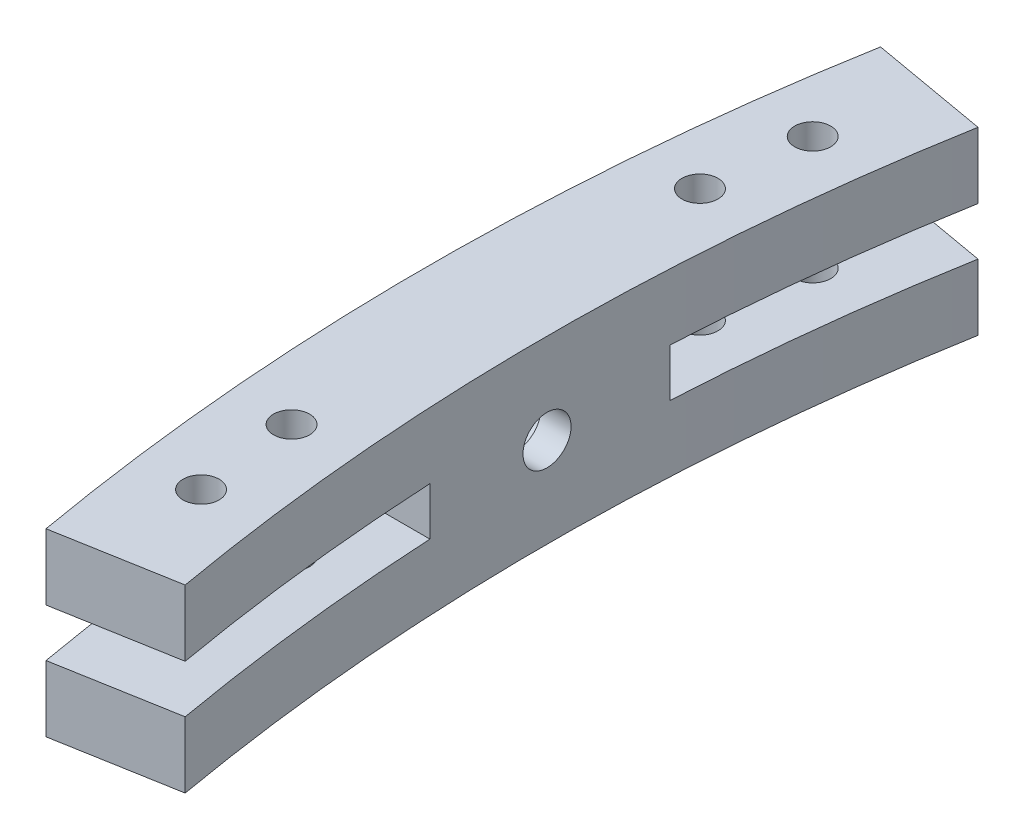
ISO-10303-21;
HEADER;
FILE_DESCRIPTION(('STEP AP214'),'2;1');
FILE_NAME('part.step','',(''),(''),'','','');
FILE_SCHEMA(('AUTOMOTIVE_DESIGN { 1 0 10303 214 1 1 1 1 }'));
ENDSEC;
DATA;
#1=APPLICATION_CONTEXT('core data for automotive mechanical design processes');
#2=APPLICATION_PROTOCOL_DEFINITION('international standard','automotive_design',2000,#1);
#3=PRODUCT_CONTEXT('',#1,'mechanical');
#4=PRODUCT('Part','Part','',(#3));
#5=PRODUCT_RELATED_PRODUCT_CATEGORY('part','',(#4));
#6=PRODUCT_DEFINITION_FORMATION('','',#4);
#7=PRODUCT_DEFINITION_CONTEXT('part definition',#1,'design');
#8=PRODUCT_DEFINITION('design','',#6,#7);
#9=PRODUCT_DEFINITION_SHAPE('','',#8);
#10=(LENGTH_UNIT() NAMED_UNIT(*) SI_UNIT(.MILLI.,.METRE.));
#11=(NAMED_UNIT(*) PLANE_ANGLE_UNIT() SI_UNIT($,.RADIAN.));
#12=(NAMED_UNIT(*) SI_UNIT($,.STERADIAN.) SOLID_ANGLE_UNIT());
#13=UNCERTAINTY_MEASURE_WITH_UNIT(LENGTH_MEASURE(1.E-05),#10,'distance_accuracy_value','');
#14=(GEOMETRIC_REPRESENTATION_CONTEXT(3) GLOBAL_UNCERTAINTY_ASSIGNED_CONTEXT((#13)) GLOBAL_UNIT_ASSIGNED_CONTEXT((#10,
#11,#12)) REPRESENTATION_CONTEXT('',''));
#15=CARTESIAN_POINT('',(0.,0.,0.));
#16=DIRECTION('',(0.,0.,1.));
#17=DIRECTION('',(1.,0.,0.));
#18=AXIS2_PLACEMENT_3D('',#15,#16,#17);
#19=CARTESIAN_POINT('',(0.,7.5,0.));
#20=DIRECTION('',(-0.173648177666931,0.,0.984807753012208));
#21=DIRECTION('',(0.984807753012208,0.,0.173648177666931));
#22=AXIS2_PLACEMENT_3D('',#19,#20,#21);
#23=PLANE('',#22);
#24=DIRECTION('',(0.984807753012207,0.,0.173648177666939));
#25=VECTOR('',#24,1.);
#26=CARTESIAN_POINT('',(-187.11347307232,-2.,-32.9931537567168));
#27=LINE('',#26,#25);
#28=CARTESIAN_POINT('',(-196.961550602442,-2.,-34.7296355333861));
#29=VERTEX_POINT('',#28);
#30=CARTESIAN_POINT('',(-187.11347307232,-2.,-32.9931537567168));
#31=VERTEX_POINT('',#30);
#32=EDGE_CURVE('E50',#29,#31,#27,.T.);
#33=ORIENTED_EDGE('',*,*,#32,.T.);
#34=DIRECTION('',(0.,-1.,0.));
#35=VECTOR('',#34,1.);
#36=CARTESIAN_POINT('',(-187.11347307232,7.5,-32.9931537567168));
#37=LINE('',#36,#35);
#38=CARTESIAN_POINT('',(-187.11347307232,-7.5,-32.9931537567168));
#39=VERTEX_POINT('',#38);
#40=EDGE_CURVE('E42',#31,#39,#37,.T.);
#41=ORIENTED_EDGE('',*,*,#40,.T.);
#42=DIRECTION('',(-0.984807753012208,0.,-0.173648177666931));
#43=VECTOR('',#42,1.);
#44=CARTESIAN_POINT('',(0.,-7.5,0.));
#45=LINE('',#44,#43);
#46=CARTESIAN_POINT('',(-196.961550602442,-7.49999999999999,-34.7296355333861));
#47=VERTEX_POINT('',#46);
#48=EDGE_CURVE('E202',#39,#47,#45,.T.);
#49=ORIENTED_EDGE('',*,*,#48,.T.);
#50=DIRECTION('',(0.,-1.,0.));
#51=VECTOR('',#50,1.);
#52=CARTESIAN_POINT('',(-196.961550602442,7.50000000000001,-34.7296355333861));
#53=LINE('',#52,#51);
#54=EDGE_CURVE('E215',#29,#47,#53,.T.);
#55=ORIENTED_EDGE('',*,*,#54,.F.);
#56=EDGE_LOOP('',(#33,#41,#49,#55));
#57=FACE_BOUND('',#56,.T.);
#58=ADVANCED_FACE('F32',(#57),#23,.F.);
#59=CARTESIAN_POINT('',(0.,7.5,0.));
#60=DIRECTION('',(0.17364817766693,0.,0.984807753012208));
#61=DIRECTION('',(0.984807753012208,0.,-0.17364817766693));
#62=AXIS2_PLACEMENT_3D('',#59,#60,#61);
#63=PLANE('',#62);
#64=DIRECTION('',(0.,-1.,0.));
#65=VECTOR('',#64,1.);
#66=CARTESIAN_POINT('',(-187.11347307232,7.5,32.9931537567168));
#67=LINE('',#66,#65);
#68=CARTESIAN_POINT('',(-187.11347307232,-2.,32.9931537567168));
#69=VERTEX_POINT('',#68);
#70=CARTESIAN_POINT('',(-187.11347307232,-7.5,32.9931537567168));
#71=VERTEX_POINT('',#70);
#72=EDGE_CURVE('E199',#69,#71,#67,.T.);
#73=ORIENTED_EDGE('',*,*,#72,.F.);
#74=DIRECTION('',(-0.984807753012207,0.,0.173648177666939));
#75=VECTOR('',#74,1.);
#76=CARTESIAN_POINT('',(-187.11347307232,-2.,32.9931537567168));
#77=LINE('',#76,#75);
#78=CARTESIAN_POINT('',(-196.961550602442,-2.,34.7296355333861));
#79=VERTEX_POINT('',#78);
#80=EDGE_CURVE('E145',#69,#79,#77,.T.);
#81=ORIENTED_EDGE('',*,*,#80,.T.);
#82=DIRECTION('',(0.,-1.,0.));
#83=VECTOR('',#82,1.);
#84=CARTESIAN_POINT('',(-196.961550602442,7.49999999999999,34.7296355333861));
#85=LINE('',#84,#83);
#86=CARTESIAN_POINT('',(-196.961550602442,-7.50000000000001,34.7296355333861));
#87=VERTEX_POINT('',#86);
#88=EDGE_CURVE('E144',#79,#87,#85,.T.);
#89=ORIENTED_EDGE('',*,*,#88,.T.);
#90=DIRECTION('',(-0.98480775301221,0.,0.173648177666931));
#91=VECTOR('',#90,1.);
#92=CARTESIAN_POINT('',(0.,-7.5,0.));
#93=LINE('',#92,#91);
#94=EDGE_CURVE('E192',#71,#87,#93,.T.);
#95=ORIENTED_EDGE('',*,*,#94,.F.);
#96=EDGE_LOOP('',(#73,#81,#89,#95));
#97=FACE_BOUND('',#96,.T.);
#98=ADVANCED_FACE('F303',(#97),#63,.T.);
#99=CARTESIAN_POINT('',(0.,7.5,0.));
#100=DIRECTION('',(0.,-1.,0.));
#101=DIRECTION('',(0.,0.,-1.));
#102=AXIS2_PLACEMENT_3D('',#99,#100,#101);
#103=CYLINDRICAL_SURFACE('',#102,190.);
#104=CARTESIAN_POINT('',(-189.989473392607,0.,2.));
#105=CARTESIAN_POINT('',(-189.989473534937,-0.112337539008205,1.99999501943647));
#106=CARTESIAN_POINT('',(-189.989574097471,-0.224756454103122,1.99050344805314));
#107=CARTESIAN_POINT('',(-189.989965591906,-0.446497979673819,1.95277152792373));
#108=CARTESIAN_POINT('',(-189.990256752724,-0.555816701723933,1.92450863325394));
#109=CARTESIAN_POINT('',(-189.990996456721,-0.768113289387756,1.85003894056516));
#110=CARTESIAN_POINT('',(-189.991444924493,-0.871094165352502,1.80384073886679));
#111=CARTESIAN_POINT('',(-189.992448611986,-1.06780942497891,1.69482370162265));
#112=CARTESIAN_POINT('',(-189.993003805212,-1.16154609477635,1.6320089896398));
#113=CARTESIAN_POINT('',(-189.994158510135,-1.33715846447027,1.49152675141592));
#114=CARTESIAN_POINT('',(-189.994758027992,-1.4190325108802,1.41385715810245));
#115=CARTESIAN_POINT('',(-189.995933754807,-1.56858218294085,1.24587185841426));
#116=CARTESIAN_POINT('',(-189.996509962849,-1.63625725003997,1.15555565478712));
#117=CARTESIAN_POINT('',(-189.997574085071,-1.75548439961241,0.964842558288193));
#118=CARTESIAN_POINT('',(-189.998061998849,-1.80703640838723,0.864445619340147));
#119=CARTESIAN_POINT('',(-189.998894519629,-1.89255320442046,0.65642146781949));
#120=CARTESIAN_POINT('',(-189.999239126954,-1.92651803136741,0.548794271563837));
#121=CARTESIAN_POINT('',(-189.999746174002,-1.97589529316899,0.329368722701593));
#122=CARTESIAN_POINT('',(-189.999908620222,-1.99130838971411,0.217570519010304));
#123=CARTESIAN_POINT('',(-190.000033052489,-2.0031466749899,-0.00702661370654219));
#124=CARTESIAN_POINT('',(-189.999995038952,-1.99957190305226,-0.119825540658708));
#125=CARTESIAN_POINT('',(-189.999722843873,-1.97353658106633,-0.343217625195078));
#126=CARTESIAN_POINT('',(-189.999488670037,-1.95107677281648,-0.453810869243158));
#127=CARTESIAN_POINT('',(-189.998850563069,-1.88791006197055,-0.669657012955504));
#128=CARTESIAN_POINT('',(-189.998446629734,-1.84720313753438,-0.774909906227705));
#129=CARTESIAN_POINT('',(-189.99751452908,-1.7486968902956,-0.977089805489578));
#130=CARTESIAN_POINT('',(-189.996986359297,-1.6908972285791,-1.07401664634154));
#131=CARTESIAN_POINT('',(-189.99586533012,-1.55984653998021,-1.25679114306814));
#132=CARTESIAN_POINT('',(-189.995272470732,-1.48659551423289,-1.34263879975666));
#133=CARTESIAN_POINT('',(-189.994088865222,-1.32671721355292,-1.50082238262437));
#134=CARTESIAN_POINT('',(-189.993498119205,-1.24008928815678,-1.57315765137366));
#135=CARTESIAN_POINT('',(-189.992385371415,-1.05591858076797,-1.70225802695415));
#136=CARTESIAN_POINT('',(-189.99186336965,-0.958375797312898,-1.75902313169917));
#137=CARTESIAN_POINT('',(-189.990946965249,-0.755143974407015,-1.85537169896404));
#138=CARTESIAN_POINT('',(-189.990552562755,-0.649454925968375,-1.8949551425269));
#139=CARTESIAN_POINT('',(-189.989935829945,-0.432930928012611,-1.95581632084273));
#140=CARTESIAN_POINT('',(-189.989713499566,-0.32209598042315,-1.97709406245298));
#141=CARTESIAN_POINT('',(-189.989465987823,-0.0984321513505981,-2.00073902736059));
#142=CARTESIAN_POINT('',(-189.989440796994,0.0143966341562552,-2.00310715842745));
#143=CARTESIAN_POINT('',(-189.989590379753,0.238850281313818,-1.98886804187189));
#144=CARTESIAN_POINT('',(-189.98976515332,0.350475143088519,-1.97226079620375));
#145=CARTESIAN_POINT('',(-189.990294952192,0.569349725460811,-1.92054310474016));
#146=CARTESIAN_POINT('',(-189.990649973499,0.676599543038903,-1.88543306933177));
#147=CARTESIAN_POINT('',(-189.991500238945,0.883682500768781,-1.79770688779331));
#148=CARTESIAN_POINT('',(-189.991995483104,0.983515639927846,-1.74509073932005));
#149=CARTESIAN_POINT('',(-189.993070383141,1.17293546669265,-1.6238436062518));
#150=CARTESIAN_POINT('',(-189.993650042236,1.26252176362361,-1.55521201134924));
#151=CARTESIAN_POINT('',(-189.9948284096,1.42890093279534,-1.40388309851136));
#152=CARTESIAN_POINT('',(-189.99542711788,1.50569379648102,-1.32118577117023));
#153=CARTESIAN_POINT('',(-189.996576112142,1.64430918234348,-1.14406902974099));
#154=CARTESIAN_POINT('',(-189.997126396218,1.70613111545511,-1.04964915462375));
#155=CARTESIAN_POINT('',(-189.998116475249,1.81304562637034,-0.851770067903167));
#156=CARTESIAN_POINT('',(-189.998556270338,1.85813822430944,-0.748310867179772));
#157=CARTESIAN_POINT('',(-189.999275780278,1.93031306450922,-0.535292199291377));
#158=CARTESIAN_POINT('',(-189.99955549857,1.95739569380162,-0.425732863272274));
#159=CARTESIAN_POINT('',(-189.999923333363,1.99278310473459,-0.203621933003262));
#160=CARTESIAN_POINT('',(-190.000011449583,2.00108785872549,-0.0910703343476127));
#161=CARTESIAN_POINT('',(-189.999986145328,1.99868365126064,0.133823906526774));
#162=CARTESIAN_POINT('',(-189.999872734968,1.98797564400946,0.246166558948756));
#163=CARTESIAN_POINT('',(-189.999457182274,1.94785178516226,0.467459707229459));
#164=CARTESIAN_POINT('',(-189.99915503956,1.91843589600307,0.576410196276667));
#165=CARTESIAN_POINT('',(-189.998396075965,1.84173082840595,0.787828127717332));
#166=CARTESIAN_POINT('',(-189.99793925222,1.79444131899421,0.890295450018079));
#167=CARTESIAN_POINT('',(-189.996922446773,1.68333349126715,1.08583267567281));
#168=CARTESIAN_POINT('',(-189.996362469084,1.61951581563763,1.17890294422891));
#169=CARTESIAN_POINT('',(-189.995202497324,1.47716718741914,1.35300431681798));
#170=CARTESIAN_POINT('',(-189.994602505507,1.3986370631904,1.43403609819786));
#171=CARTESIAN_POINT('',(-189.993429958376,1.22906454906447,1.58178621697648));
#172=CARTESIAN_POINT('',(-189.992857409915,1.13801905555409,1.64850099344186));
#173=CARTESIAN_POINT('',(-189.991804202099,0.945981998429923,1.76572507052124));
#174=CARTESIAN_POINT('',(-189.991323588684,0.844985500332467,1.81622627778985));
#175=CARTESIAN_POINT('',(-189.990509391978,0.636026090149733,1.89949770549004));
#176=CARTESIAN_POINT('',(-189.99017563263,0.528071698725362,1.9322891683176));
#177=CARTESIAN_POINT('',(-189.989782411934,0.349525040636143,1.97047672721812));
#178=CARTESIAN_POINT('',(-189.989667029421,0.280092781351769,1.98153412347031));
#179=CARTESIAN_POINT('',(-189.989512475261,0.140450953055426,1.99629731683116));
#180=CARTESIAN_POINT('',(-189.989473303612,0.0702413840710722,2.000003114201));
#181=CARTESIAN_POINT('',(-189.989473392607,0.,2.));
#182=B_SPLINE_CURVE_WITH_KNOTS('',3,(#104,#105,#106,#107,#108,#109,#110,#111,#112,#113,#114,
#115,#116,#117,#118,#119,#120,#121,#122,#123,#124,#125,#126,#127,#128,#129,#130,#131,#132,#133,
#134,#135,#136,#137,#138,#139,#140,#141,#142,#143,#144,#145,#146,#147,#148,#149,#150,#151,#152,
#153,#154,#155,#156,#157,#158,#159,#160,#161,#162,#163,#164,#165,#166,#167,#168,#169,#170,#171,
#172,#173,#174,#175,#176,#177,#178,#179,#180,#181),.UNSPECIFIED.,.T.,.F.,(4,2,2,2,2,2,2,2,2,2,2,
2,2,2,2,2,2,2,2,2,2,2,2,2,2,2,2,2,2,2,2,2,2,2,2,2,2,2,4),(0.,0.33675623501899,0.673917675562619,
1.01091771509458,1.34783420282603,1.68479760699719,2.02177426396425,2.358752461229,
2.69572989804032,3.03269531541354,3.36966003479325,3.70661151892043,4.04356340634798,
4.38052197528781,4.71748051947455,5.05445545372923,5.39143043313335,5.72840578432972,
6.06538100929551,6.40234005742513,6.73929907085122,7.07625061092859,7.41320219610678,
7.7501666237424,8.08713127670819,8.42410918615776,8.76108669001805,9.0980569520446,
9.43502771024623,9.77198155717725,10.1089360806729,10.4458968440115,10.7828445068408,
11.1197732040841,11.456785605542,11.7939659732373,12.1307409981614,12.3413048496708,
12.5518686936996),.UNSPECIFIED.);
#183=CARTESIAN_POINT('',(-189.989473392607,0.,2.));
#184=VERTEX_POINT('',#183);
#185=EDGE_CURVE('E234',#184,#184,#182,.T.);
#186=ORIENTED_EDGE('',*,*,#185,.F.);
#187=EDGE_LOOP('',(#186));
#188=FACE_BOUND('',#187,.T.);
#189=CARTESIAN_POINT('',(0.,2.,0.));
#190=DIRECTION('',(0.,1.,0.));
#191=DIRECTION('',(0.,0.,1.));
#192=AXIS2_PLACEMENT_3D('',#189,#190,#191);
#193=CIRCLE('',#192,190.);
#194=CARTESIAN_POINT('',(-187.11347307232,2.,32.9931537567168));
#195=VERTEX_POINT('',#194);
#196=CARTESIAN_POINT('',(-189.736659610103,2.,10.));
#197=VERTEX_POINT('',#196);
#198=EDGE_CURVE('E161',#195,#197,#193,.F.);
#199=ORIENTED_EDGE('',*,*,#198,.T.);
#200=DIRECTION('',(0.,-1.,0.));
#201=VECTOR('',#200,1.);
#202=CARTESIAN_POINT('',(-189.736659610103,29.7710772670783,10.));
#203=LINE('',#202,#201);
#204=CARTESIAN_POINT('',(-189.736659610103,-2.,10.));
#205=VERTEX_POINT('',#204);
#206=EDGE_CURVE('E134',#197,#205,#203,.T.);
#207=ORIENTED_EDGE('',*,*,#206,.T.);
#208=CARTESIAN_POINT('',(0.,-2.,0.));
#209=DIRECTION('',(0.,1.,0.));
#210=DIRECTION('',(0.,0.,1.));
#211=AXIS2_PLACEMENT_3D('',#208,#209,#210);
#212=CIRCLE('',#211,190.);
#213=EDGE_CURVE('E138',#205,#69,#212,.T.);
#214=ORIENTED_EDGE('',*,*,#213,.T.);
#215=ORIENTED_EDGE('',*,*,#72,.T.);
#216=CARTESIAN_POINT('',(0.,-7.5,0.));
#217=DIRECTION('',(0.,1.,0.));
#218=DIRECTION('',(0.,0.,1.));
#219=AXIS2_PLACEMENT_3D('',#216,#217,#218);
#220=CIRCLE('',#219,190.);
#221=EDGE_CURVE('E159',#39,#71,#220,.T.);
#222=ORIENTED_EDGE('',*,*,#221,.F.);
#223=ORIENTED_EDGE('',*,*,#40,.F.);
#224=CARTESIAN_POINT('',(0.,-2.,0.));
#225=DIRECTION('',(0.,1.,0.));
#226=DIRECTION('',(0.,0.,1.));
#227=AXIS2_PLACEMENT_3D('',#224,#225,#226);
#228=CIRCLE('',#227,190.);
#229=CARTESIAN_POINT('',(-189.736659610103,-2.,-10.));
#230=VERTEX_POINT('',#229);
#231=EDGE_CURVE('E173',#31,#230,#228,.T.);
#232=ORIENTED_EDGE('',*,*,#231,.T.);
#233=DIRECTION('',(0.,-1.,0.));
#234=VECTOR('',#233,1.);
#235=CARTESIAN_POINT('',(-189.736659610103,29.7710772670783,-10.));
#236=LINE('',#235,#234);
#237=CARTESIAN_POINT('',(-189.736659610103,2.,-10.));
#238=VERTEX_POINT('',#237);
#239=EDGE_CURVE('E178',#238,#230,#236,.T.);
#240=ORIENTED_EDGE('',*,*,#239,.F.);
#241=CARTESIAN_POINT('',(0.,2.,0.));
#242=DIRECTION('',(0.,1.,0.));
#243=DIRECTION('',(0.,0.,1.));
#244=AXIS2_PLACEMENT_3D('',#241,#242,#243);
#245=CIRCLE('',#244,190.);
#246=CARTESIAN_POINT('',(-187.11347307232,2.,-32.9931537567168));
#247=VERTEX_POINT('',#246);
#248=EDGE_CURVE('E172',#247,#238,#245,.T.);
#249=ORIENTED_EDGE('',*,*,#248,.F.);
#250=CARTESIAN_POINT('',(-187.11347307232,7.5,-32.9931537567168));
#251=VERTEX_POINT('',#250);
#252=EDGE_CURVE('E11',#251,#247,#37,.T.);
#253=ORIENTED_EDGE('',*,*,#252,.F.);
#254=CARTESIAN_POINT('',(0.,7.5,0.));
#255=DIRECTION('',(0.,1.,0.));
#256=DIRECTION('',(0.,0.,1.));
#257=AXIS2_PLACEMENT_3D('',#254,#255,#256);
#258=CIRCLE('',#257,190.);
#259=CARTESIAN_POINT('',(-187.11347307232,7.5,32.9931537567168));
#260=VERTEX_POINT('',#259);
#261=EDGE_CURVE('E188',#251,#260,#258,.T.);
#262=ORIENTED_EDGE('',*,*,#261,.T.);
#263=EDGE_CURVE('E209',#260,#195,#67,.T.);
#264=ORIENTED_EDGE('',*,*,#263,.T.);
#265=EDGE_LOOP('',(#199,#207,#214,#215,#222,#223,#232,#240,#249,#253,#262,#264));
#266=FACE_BOUND('',#265,.T.);
#267=ADVANCED_FACE('F34',(#188,#266),#103,.F.);
#268=ORIENTED_EDGE('',*,*,#252,.T.);
#269=DIRECTION('',(-0.984807753012207,0.,-0.173648177666939));
#270=VECTOR('',#269,1.);
#271=CARTESIAN_POINT('',(-187.11347307232,2.,-32.9931537567168));
#272=LINE('',#271,#270);
#273=CARTESIAN_POINT('',(-196.961550602442,2.,-34.7296355333861));
#274=VERTEX_POINT('',#273);
#275=EDGE_CURVE('E150',#247,#274,#272,.T.);
#276=ORIENTED_EDGE('',*,*,#275,.T.);
#277=CARTESIAN_POINT('',(-196.961550602442,7.50000000000001,-34.7296355333861));
#278=VERTEX_POINT('',#277);
#279=EDGE_CURVE('E216',#278,#274,#53,.T.);
#280=ORIENTED_EDGE('',*,*,#279,.F.);
#281=DIRECTION('',(-0.984807753012208,0.,-0.173648177666931));
#282=VECTOR('',#281,1.);
#283=CARTESIAN_POINT('',(0.,7.5,0.));
#284=LINE('',#283,#282);
#285=EDGE_CURVE('E191',#251,#278,#284,.T.);
#286=ORIENTED_EDGE('',*,*,#285,.F.);
#287=EDGE_LOOP('',(#268,#276,#280,#286));
#288=FACE_BOUND('',#287,.T.);
#289=ADVANCED_FACE('F305',(#288),#23,.F.);
#290=CARTESIAN_POINT('',(0.,7.5,0.));
#291=DIRECTION('',(0.,-1.,0.));
#292=DIRECTION('',(0.,0.,-1.));
#293=AXIS2_PLACEMENT_3D('',#290,#291,#292);
#294=CYLINDRICAL_SURFACE('',#293,200.);
#295=DIRECTION('',(0.,-1.,0.));
#296=VECTOR('',#295,1.);
#297=CARTESIAN_POINT('',(-199.749843554382,29.7710772670783,10.));
#298=LINE('',#297,#296);
#299=CARTESIAN_POINT('',(-199.749843554382,2.,10.));
#300=VERTEX_POINT('',#299);
#301=CARTESIAN_POINT('',(-199.749843554382,-2.,10.));
#302=VERTEX_POINT('',#301);
#303=EDGE_CURVE('E125',#300,#302,#298,.T.);
#304=ORIENTED_EDGE('',*,*,#303,.F.);
#305=CARTESIAN_POINT('',(0.,2.,0.));
#306=DIRECTION('',(0.,1.,0.));
#307=DIRECTION('',(0.,0.,1.));
#308=AXIS2_PLACEMENT_3D('',#305,#306,#307);
#309=CIRCLE('',#308,200.);
#310=CARTESIAN_POINT('',(-196.961550602442,2.,34.729635533386));
#311=VERTEX_POINT('',#310);
#312=EDGE_CURVE('E157',#300,#311,#309,.T.);
#313=ORIENTED_EDGE('',*,*,#312,.T.);
#314=CARTESIAN_POINT('',(-196.961550602442,7.49999999999999,34.7296355333861));
#315=VERTEX_POINT('',#314);
#316=EDGE_CURVE('E212',#315,#311,#85,.T.);
#317=ORIENTED_EDGE('',*,*,#316,.F.);
#318=CARTESIAN_POINT('',(0.,7.5,0.));
#319=DIRECTION('',(0.,1.,0.));
#320=DIRECTION('',(0.,0.,1.));
#321=AXIS2_PLACEMENT_3D('',#318,#319,#320);
#322=CIRCLE('',#321,200.);
#323=EDGE_CURVE('E194',#278,#315,#322,.T.);
#324=ORIENTED_EDGE('',*,*,#323,.F.);
#325=ORIENTED_EDGE('',*,*,#279,.T.);
#326=CARTESIAN_POINT('',(0.,2.,0.));
#327=DIRECTION('',(0.,1.,0.));
#328=DIRECTION('',(0.,0.,1.));
#329=AXIS2_PLACEMENT_3D('',#326,#327,#328);
#330=CIRCLE('',#329,200.);
#331=CARTESIAN_POINT('',(-199.749843554382,2.,-10.));
#332=VERTEX_POINT('',#331);
#333=EDGE_CURVE('E146',#274,#332,#330,.T.);
#334=ORIENTED_EDGE('',*,*,#333,.T.);
#335=DIRECTION('',(0.,-1.,0.));
#336=VECTOR('',#335,1.);
#337=CARTESIAN_POINT('',(-199.749843554382,29.7710772670783,-10.));
#338=LINE('',#337,#336);
#339=CARTESIAN_POINT('',(-199.749843554382,-2.,-10.));
#340=VERTEX_POINT('',#339);
#341=EDGE_CURVE('E182',#332,#340,#338,.T.);
#342=ORIENTED_EDGE('',*,*,#341,.T.);
#343=CARTESIAN_POINT('',(0.,-2.,0.));
#344=DIRECTION('',(0.,1.,0.));
#345=DIRECTION('',(0.,0.,1.));
#346=AXIS2_PLACEMENT_3D('',#343,#344,#345);
#347=CIRCLE('',#346,200.);
#348=EDGE_CURVE('E167',#29,#340,#347,.T.);
#349=ORIENTED_EDGE('',*,*,#348,.F.);
#350=ORIENTED_EDGE('',*,*,#54,.T.);
#351=CARTESIAN_POINT('',(0.,-7.5,0.));
#352=DIRECTION('',(0.,1.,0.));
#353=DIRECTION('',(0.,0.,1.));
#354=AXIS2_PLACEMENT_3D('',#351,#352,#353);
#355=CIRCLE('',#354,200.);
#356=EDGE_CURVE('E205',#47,#87,#355,.T.);
#357=ORIENTED_EDGE('',*,*,#356,.T.);
#358=ORIENTED_EDGE('',*,*,#88,.F.);
#359=CARTESIAN_POINT('',(0.,-2.,0.));
#360=DIRECTION('',(0.,1.,0.));
#361=DIRECTION('',(0.,0.,1.));
#362=AXIS2_PLACEMENT_3D('',#359,#360,#361);
#363=CIRCLE('',#362,200.);
#364=EDGE_CURVE('E58',#79,#302,#363,.F.);
#365=ORIENTED_EDGE('',*,*,#364,.T.);
#366=EDGE_LOOP('',(#304,#313,#317,#324,#325,#334,#342,#349,#350,#357,#358,#365));
#367=FACE_BOUND('',#366,.T.);
#368=ADVANCED_FACE('F142',(#367),#294,.T.);
#369=DIRECTION('',(0.984807753012207,0.,-0.173648177666939));
#370=VECTOR('',#369,1.);
#371=CARTESIAN_POINT('',(-187.11347307232,2.,32.9931537567168));
#372=LINE('',#371,#370);
#373=EDGE_CURVE('E133',#311,#195,#372,.T.);
#374=ORIENTED_EDGE('',*,*,#373,.T.);
#375=ORIENTED_EDGE('',*,*,#263,.F.);
#376=DIRECTION('',(-0.98480775301221,0.,0.173648177666931));
#377=VECTOR('',#376,1.);
#378=CARTESIAN_POINT('',(0.,7.5,0.));
#379=LINE('',#378,#377);
#380=EDGE_CURVE('E196',#260,#315,#379,.T.);
#381=ORIENTED_EDGE('',*,*,#380,.T.);
#382=ORIENTED_EDGE('',*,*,#316,.T.);
#383=EDGE_LOOP('',(#374,#375,#381,#382));
#384=FACE_BOUND('',#383,.T.);
#385=ADVANCED_FACE('F295',(#384),#63,.T.);
#386=CARTESIAN_POINT('',(0.,7.5,0.));
#387=DIRECTION('',(0.,1.,0.));
#388=DIRECTION('',(0.,0.,1.));
#389=AXIS2_PLACEMENT_3D('',#386,#387,#388);
#390=PLANE('',#389);
#391=CARTESIAN_POINT('',(-193.331747967893,7.50000000000001,-25.4526074829102));
#392=DIRECTION('',(0.,1.,0.));
#393=DIRECTION('',(0.,0.,1.));
#394=AXIS2_PLACEMENT_3D('',#391,#392,#393);
#395=CIRCLE('',#394,1.5);
#396=CARTESIAN_POINT('',(-193.331747967893,7.50000000000001,-23.9526074829102));
#397=VERTEX_POINT('',#396);
#398=EDGE_CURVE('E400',#397,#397,#395,.T.);
#399=ORIENTED_EDGE('',*,*,#398,.F.);
#400=EDGE_LOOP('',(#399));
#401=FACE_BOUND('',#400,.T.);
#402=CARTESIAN_POINT('',(-194.25796612789,7.50000000000001,-16.9953698357934));
#403=DIRECTION('',(0.,1.,0.));
#404=DIRECTION('',(0.,0.,1.));
#405=AXIS2_PLACEMENT_3D('',#402,#403,#404);
#406=CIRCLE('',#405,1.5);
#407=CARTESIAN_POINT('',(-194.25796612789,7.50000000000001,-15.4953698357934));
#408=VERTEX_POINT('',#407);
#409=EDGE_CURVE('E406',#408,#408,#406,.T.);
#410=ORIENTED_EDGE('',*,*,#409,.F.);
#411=EDGE_LOOP('',(#410));
#412=FACE_BOUND('',#411,.T.);
#413=CARTESIAN_POINT('',(-194.25796612789,7.50000000000001,16.9953698357934));
#414=DIRECTION('',(0.,1.,0.));
#415=DIRECTION('',(0.,0.,-1.));
#416=AXIS2_PLACEMENT_3D('',#413,#414,#415);
#417=CIRCLE('',#416,1.5);
#418=CARTESIAN_POINT('',(-194.25796612789,7.50000000000001,15.4953698357934));
#419=VERTEX_POINT('',#418);
#420=EDGE_CURVE('E412',#419,#419,#417,.T.);
#421=ORIENTED_EDGE('',*,*,#420,.F.);
#422=EDGE_LOOP('',(#421));
#423=FACE_BOUND('',#422,.T.);
#424=CARTESIAN_POINT('',(-193.331747967893,7.50000000000001,25.4526074829102));
#425=DIRECTION('',(0.,1.,0.));
#426=DIRECTION('',(0.,0.,-1.));
#427=AXIS2_PLACEMENT_3D('',#424,#425,#426);
#428=CIRCLE('',#427,1.5);
#429=CARTESIAN_POINT('',(-193.331747967893,7.50000000000001,23.9526074829102));
#430=VERTEX_POINT('',#429);
#431=EDGE_CURVE('E240',#430,#430,#428,.T.);
#432=ORIENTED_EDGE('',*,*,#431,.F.);
#433=EDGE_LOOP('',(#432));
#434=FACE_BOUND('',#433,.T.);
#435=ORIENTED_EDGE('',*,*,#261,.F.);
#436=ORIENTED_EDGE('',*,*,#285,.T.);
#437=ORIENTED_EDGE('',*,*,#323,.T.);
#438=ORIENTED_EDGE('',*,*,#380,.F.);
#439=EDGE_LOOP('',(#435,#436,#437,#438));
#440=FACE_BOUND('',#439,.T.);
#441=ADVANCED_FACE('F292',(#401,#412,#423,#434,#440),#390,.T.);
#442=CARTESIAN_POINT('',(0.,-7.5,0.));
#443=DIRECTION('',(0.,1.,0.));
#444=DIRECTION('',(0.,0.,1.));
#445=AXIS2_PLACEMENT_3D('',#442,#443,#444);
#446=PLANE('',#445);
#447=CARTESIAN_POINT('',(-193.331747967893,-7.50000000000001,-25.4526074829102));
#448=DIRECTION('',(0.,1.,0.));
#449=DIRECTION('',(0.,0.,1.));
#450=AXIS2_PLACEMENT_3D('',#447,#448,#449);
#451=CIRCLE('',#450,1.5);
#452=CARTESIAN_POINT('',(-193.331747967893,-7.50000000000001,-23.9526074829102));
#453=VERTEX_POINT('',#452);
#454=EDGE_CURVE('E223',#453,#453,#451,.T.);
#455=ORIENTED_EDGE('',*,*,#454,.T.);
#456=EDGE_LOOP('',(#455));
#457=FACE_BOUND('',#456,.T.);
#458=CARTESIAN_POINT('',(-194.25796612789,-7.50000000000001,-16.9953698357934));
#459=DIRECTION('',(0.,1.,0.));
#460=DIRECTION('',(0.,0.,1.));
#461=AXIS2_PLACEMENT_3D('',#458,#459,#460);
#462=CIRCLE('',#461,1.5);
#463=CARTESIAN_POINT('',(-194.25796612789,-7.50000000000001,-15.4953698357934));
#464=VERTEX_POINT('',#463);
#465=EDGE_CURVE('E403',#464,#464,#462,.T.);
#466=ORIENTED_EDGE('',*,*,#465,.T.);
#467=EDGE_LOOP('',(#466));
#468=FACE_BOUND('',#467,.T.);
#469=CARTESIAN_POINT('',(-194.25796612789,-7.50000000000001,16.9953698357934));
#470=DIRECTION('',(0.,1.,0.));
#471=DIRECTION('',(0.,0.,-1.));
#472=AXIS2_PLACEMENT_3D('',#469,#470,#471);
#473=CIRCLE('',#472,1.5);
#474=CARTESIAN_POINT('',(-194.25796612789,-7.50000000000001,15.4953698357934));
#475=VERTEX_POINT('',#474);
#476=EDGE_CURVE('E409',#475,#475,#473,.T.);
#477=ORIENTED_EDGE('',*,*,#476,.T.);
#478=EDGE_LOOP('',(#477));
#479=FACE_BOUND('',#478,.T.);
#480=CARTESIAN_POINT('',(-193.331747967893,-7.50000000000001,25.4526074829102));
#481=DIRECTION('',(0.,1.,0.));
#482=DIRECTION('',(0.,0.,-1.));
#483=AXIS2_PLACEMENT_3D('',#480,#481,#482);
#484=CIRCLE('',#483,1.5);
#485=CARTESIAN_POINT('',(-193.331747967893,-7.50000000000001,23.9526074829102));
#486=VERTEX_POINT('',#485);
#487=EDGE_CURVE('E415',#486,#486,#484,.T.);
#488=ORIENTED_EDGE('',*,*,#487,.T.);
#489=EDGE_LOOP('',(#488));
#490=FACE_BOUND('',#489,.T.);
#491=ORIENTED_EDGE('',*,*,#221,.T.);
#492=ORIENTED_EDGE('',*,*,#94,.T.);
#493=ORIENTED_EDGE('',*,*,#356,.F.);
#494=ORIENTED_EDGE('',*,*,#48,.F.);
#495=EDGE_LOOP('',(#491,#492,#493,#494));
#496=FACE_BOUND('',#495,.T.);
#497=ADVANCED_FACE('F278',(#457,#468,#479,#490,#496),#446,.F.);
#498=CARTESIAN_POINT('',(-189.736659610103,29.7710772670783,10.));
#499=DIRECTION('',(0.,0.,1.));
#500=DIRECTION('',(1.,0.,0.));
#501=AXIS2_PLACEMENT_3D('',#498,#499,#500);
#502=PLANE('',#501);
#503=DIRECTION('',(-1.,0.,0.));
#504=VECTOR('',#503,1.);
#505=CARTESIAN_POINT('',(-189.736659610103,2.,10.));
#506=LINE('',#505,#504);
#507=EDGE_CURVE('E130',#197,#300,#506,.T.);
#508=ORIENTED_EDGE('',*,*,#507,.T.);
#509=ORIENTED_EDGE('',*,*,#303,.T.);
#510=DIRECTION('',(1.,0.,0.));
#511=VECTOR('',#510,1.);
#512=CARTESIAN_POINT('',(-189.736659610103,-2.,10.));
#513=LINE('',#512,#511);
#514=EDGE_CURVE('E128',#302,#205,#513,.T.);
#515=ORIENTED_EDGE('',*,*,#514,.T.);
#516=ORIENTED_EDGE('',*,*,#206,.F.);
#517=EDGE_LOOP('',(#508,#509,#515,#516));
#518=FACE_BOUND('',#517,.T.);
#519=ADVANCED_FACE('F126',(#518),#502,.T.);
#520=CARTESIAN_POINT('',(0.,2.,0.));
#521=DIRECTION('',(0.,1.,0.));
#522=DIRECTION('',(0.,0.,1.));
#523=AXIS2_PLACEMENT_3D('',#520,#521,#522);
#524=PLANE('',#523);
#525=CARTESIAN_POINT('',(-194.25796612789,2.,16.9953698357934));
#526=DIRECTION('',(0.,1.,0.));
#527=DIRECTION('',(0.,0.,1.));
#528=AXIS2_PLACEMENT_3D('',#525,#526,#527);
#529=CIRCLE('',#528,1.5);
#530=CARTESIAN_POINT('',(-194.25796612789,2.,18.4953698357934));
#531=VERTEX_POINT('',#530);
#532=EDGE_CURVE('E153',#531,#531,#529,.T.);
#533=ORIENTED_EDGE('',*,*,#532,.T.);
#534=EDGE_LOOP('',(#533));
#535=FACE_BOUND('',#534,.T.);
#536=CARTESIAN_POINT('',(-193.331747967893,2.,25.4526074829102));
#537=DIRECTION('',(0.,1.,0.));
#538=DIRECTION('',(0.,0.,1.));
#539=AXIS2_PLACEMENT_3D('',#536,#537,#538);
#540=CIRCLE('',#539,1.5);
#541=CARTESIAN_POINT('',(-193.331747967893,2.,26.9526074829102));
#542=VERTEX_POINT('',#541);
#543=EDGE_CURVE('E231',#542,#542,#540,.T.);
#544=ORIENTED_EDGE('',*,*,#543,.T.);
#545=EDGE_LOOP('',(#544));
#546=FACE_BOUND('',#545,.T.);
#547=ORIENTED_EDGE('',*,*,#373,.F.);
#548=ORIENTED_EDGE('',*,*,#312,.F.);
#549=ORIENTED_EDGE('',*,*,#507,.F.);
#550=ORIENTED_EDGE('',*,*,#198,.F.);
#551=EDGE_LOOP('',(#547,#548,#549,#550));
#552=FACE_BOUND('',#551,.T.);
#553=ADVANCED_FACE('F274',(#535,#546,#552),#524,.F.);
#554=CARTESIAN_POINT('',(0.,-2.,0.));
#555=DIRECTION('',(0.,1.,0.));
#556=DIRECTION('',(0.,0.,1.));
#557=AXIS2_PLACEMENT_3D('',#554,#555,#556);
#558=PLANE('',#557);
#559=CARTESIAN_POINT('',(-194.25796612789,-2.,16.9953698357934));
#560=DIRECTION('',(0.,1.,0.));
#561=DIRECTION('',(0.,0.,1.));
#562=AXIS2_PLACEMENT_3D('',#559,#560,#561);
#563=CIRCLE('',#562,1.5);
#564=CARTESIAN_POINT('',(-194.25796612789,-2.,18.4953698357934));
#565=VERTEX_POINT('',#564);
#566=EDGE_CURVE('E232',#565,#565,#563,.T.);
#567=ORIENTED_EDGE('',*,*,#566,.F.);
#568=EDGE_LOOP('',(#567));
#569=FACE_BOUND('',#568,.T.);
#570=CARTESIAN_POINT('',(-193.331747967893,-2.,25.4526074829102));
#571=DIRECTION('',(0.,1.,0.));
#572=DIRECTION('',(0.,0.,1.));
#573=AXIS2_PLACEMENT_3D('',#570,#571,#572);
#574=CIRCLE('',#573,1.5);
#575=CARTESIAN_POINT('',(-193.331747967893,-2.,26.9526074829102));
#576=VERTEX_POINT('',#575);
#577=EDGE_CURVE('E228',#576,#576,#574,.T.);
#578=ORIENTED_EDGE('',*,*,#577,.F.);
#579=EDGE_LOOP('',(#578));
#580=FACE_BOUND('',#579,.T.);
#581=ORIENTED_EDGE('',*,*,#213,.F.);
#582=ORIENTED_EDGE('',*,*,#514,.F.);
#583=ORIENTED_EDGE('',*,*,#364,.F.);
#584=ORIENTED_EDGE('',*,*,#80,.F.);
#585=EDGE_LOOP('',(#581,#582,#583,#584));
#586=FACE_BOUND('',#585,.T.);
#587=ADVANCED_FACE('F136',(#569,#580,#586),#558,.T.);
#588=CARTESIAN_POINT('',(-189.736659610103,29.7710772670783,-10.));
#589=DIRECTION('',(0.,0.,-1.));
#590=DIRECTION('',(-1.,0.,0.));
#591=AXIS2_PLACEMENT_3D('',#588,#589,#590);
#592=PLANE('',#591);
#593=DIRECTION('',(-1.,0.,0.));
#594=VECTOR('',#593,1.);
#595=CARTESIAN_POINT('',(200.,2.,-10.));
#596=LINE('',#595,#594);
#597=EDGE_CURVE('E179',#238,#332,#596,.T.);
#598=ORIENTED_EDGE('',*,*,#597,.F.);
#599=ORIENTED_EDGE('',*,*,#239,.T.);
#600=DIRECTION('',(-1.,0.,0.));
#601=VECTOR('',#600,1.);
#602=CARTESIAN_POINT('',(200.,-2.,-10.));
#603=LINE('',#602,#601);
#604=EDGE_CURVE('E169',#230,#340,#603,.T.);
#605=ORIENTED_EDGE('',*,*,#604,.T.);
#606=ORIENTED_EDGE('',*,*,#341,.F.);
#607=EDGE_LOOP('',(#598,#599,#605,#606));
#608=FACE_BOUND('',#607,.T.);
#609=ADVANCED_FACE('F273',(#608),#592,.T.);
#610=CARTESIAN_POINT('',(0.,2.,0.));
#611=DIRECTION('',(0.,1.,0.));
#612=DIRECTION('',(0.,0.,1.));
#613=AXIS2_PLACEMENT_3D('',#610,#611,#612);
#614=PLANE('',#613);
#615=CARTESIAN_POINT('',(-193.331747967893,2.,-25.4526074829102));
#616=DIRECTION('',(0.,1.,0.));
#617=DIRECTION('',(0.,0.,1.));
#618=AXIS2_PLACEMENT_3D('',#615,#616,#617);
#619=CIRCLE('',#618,1.5);
#620=CARTESIAN_POINT('',(-193.331747967893,2.,-23.9526074829102));
#621=VERTEX_POINT('',#620);
#622=EDGE_CURVE('E227',#621,#621,#619,.T.);
#623=ORIENTED_EDGE('',*,*,#622,.T.);
#624=EDGE_LOOP('',(#623));
#625=FACE_BOUND('',#624,.T.);
#626=CARTESIAN_POINT('',(-194.25796612789,2.,-16.9953698357934));
#627=DIRECTION('',(0.,1.,0.));
#628=DIRECTION('',(0.,0.,1.));
#629=AXIS2_PLACEMENT_3D('',#626,#627,#628);
#630=CIRCLE('',#629,1.5);
#631=CARTESIAN_POINT('',(-194.25796612789,2.,-15.4953698357934));
#632=VERTEX_POINT('',#631);
#633=EDGE_CURVE('E222',#632,#632,#630,.T.);
#634=ORIENTED_EDGE('',*,*,#633,.T.);
#635=EDGE_LOOP('',(#634));
#636=FACE_BOUND('',#635,.T.);
#637=ORIENTED_EDGE('',*,*,#248,.T.);
#638=ORIENTED_EDGE('',*,*,#597,.T.);
#639=ORIENTED_EDGE('',*,*,#333,.F.);
#640=ORIENTED_EDGE('',*,*,#275,.F.);
#641=EDGE_LOOP('',(#637,#638,#639,#640));
#642=FACE_BOUND('',#641,.T.);
#643=ADVANCED_FACE('F284',(#625,#636,#642),#614,.F.);
#644=CARTESIAN_POINT('',(0.,-2.,0.));
#645=DIRECTION('',(0.,1.,0.));
#646=DIRECTION('',(0.,0.,1.));
#647=AXIS2_PLACEMENT_3D('',#644,#645,#646);
#648=PLANE('',#647);
#649=CARTESIAN_POINT('',(-193.331747967893,-2.,-25.4526074829102));
#650=DIRECTION('',(0.,1.,0.));
#651=DIRECTION('',(0.,0.,1.));
#652=AXIS2_PLACEMENT_3D('',#649,#650,#651);
#653=CIRCLE('',#652,1.5);
#654=CARTESIAN_POINT('',(-193.331747967893,-2.,-23.9526074829102));
#655=VERTEX_POINT('',#654);
#656=EDGE_CURVE('E224',#655,#655,#653,.T.);
#657=ORIENTED_EDGE('',*,*,#656,.F.);
#658=EDGE_LOOP('',(#657));
#659=FACE_BOUND('',#658,.T.);
#660=CARTESIAN_POINT('',(-194.25796612789,-2.,-16.9953698357934));
#661=DIRECTION('',(0.,1.,0.));
#662=DIRECTION('',(0.,0.,1.));
#663=AXIS2_PLACEMENT_3D('',#660,#661,#662);
#664=CIRCLE('',#663,1.5);
#665=CARTESIAN_POINT('',(-194.25796612789,-2.,-15.4953698357934));
#666=VERTEX_POINT('',#665);
#667=EDGE_CURVE('E219',#666,#666,#664,.T.);
#668=ORIENTED_EDGE('',*,*,#667,.F.);
#669=EDGE_LOOP('',(#668));
#670=FACE_BOUND('',#669,.T.);
#671=ORIENTED_EDGE('',*,*,#348,.T.);
#672=ORIENTED_EDGE('',*,*,#604,.F.);
#673=ORIENTED_EDGE('',*,*,#231,.F.);
#674=ORIENTED_EDGE('',*,*,#32,.F.);
#675=EDGE_LOOP('',(#671,#672,#673,#674));
#676=FACE_BOUND('',#675,.T.);
#677=ADVANCED_FACE('F260',(#659,#670,#676),#648,.T.);
#678=CARTESIAN_POINT('',(-194.25796612789,-7.50000000000001,-16.9953698357934));
#679=DIRECTION('',(0.,1.,0.));
#680=DIRECTION('',(0.,0.,1.));
#681=AXIS2_PLACEMENT_3D('',#678,#679,#680);
#682=CYLINDRICAL_SURFACE('',#681,1.5);
#683=ORIENTED_EDGE('',*,*,#667,.T.);
#684=EDGE_LOOP('',(#683));
#685=FACE_BOUND('',#684,.T.);
#686=ORIENTED_EDGE('',*,*,#465,.F.);
#687=EDGE_LOOP('',(#686));
#688=FACE_BOUND('',#687,.T.);
#689=ADVANCED_FACE('F255',(#685,#688),#682,.F.);
#690=CARTESIAN_POINT('',(-193.331747967893,-7.50000000000001,-25.4526074829102));
#691=DIRECTION('',(0.,1.,0.));
#692=DIRECTION('',(0.,0.,1.));
#693=AXIS2_PLACEMENT_3D('',#690,#691,#692);
#694=CYLINDRICAL_SURFACE('',#693,1.5);
#695=ORIENTED_EDGE('',*,*,#656,.T.);
#696=EDGE_LOOP('',(#695));
#697=FACE_BOUND('',#696,.T.);
#698=ORIENTED_EDGE('',*,*,#454,.F.);
#699=EDGE_LOOP('',(#698));
#700=FACE_BOUND('',#699,.T.);
#701=ADVANCED_FACE('F251',(#697,#700),#694,.F.);
#702=ORIENTED_EDGE('',*,*,#409,.T.);
#703=EDGE_LOOP('',(#702));
#704=FACE_BOUND('',#703,.T.);
#705=ORIENTED_EDGE('',*,*,#633,.F.);
#706=EDGE_LOOP('',(#705));
#707=FACE_BOUND('',#706,.T.);
#708=ADVANCED_FACE('F254',(#704,#707),#682,.F.);
#709=ORIENTED_EDGE('',*,*,#398,.T.);
#710=EDGE_LOOP('',(#709));
#711=FACE_BOUND('',#710,.T.);
#712=ORIENTED_EDGE('',*,*,#622,.F.);
#713=EDGE_LOOP('',(#712));
#714=FACE_BOUND('',#713,.T.);
#715=ADVANCED_FACE('F257',(#711,#714),#694,.F.);
#716=CARTESIAN_POINT('',(-193.331747967893,-7.50000000000001,25.4526074829102));
#717=DIRECTION('',(0.,1.,0.));
#718=DIRECTION('',(0.,0.,1.));
#719=AXIS2_PLACEMENT_3D('',#716,#717,#718);
#720=CYLINDRICAL_SURFACE('',#719,1.5);
#721=ORIENTED_EDGE('',*,*,#577,.T.);
#722=EDGE_LOOP('',(#721));
#723=FACE_BOUND('',#722,.T.);
#724=ORIENTED_EDGE('',*,*,#487,.F.);
#725=EDGE_LOOP('',(#724));
#726=FACE_BOUND('',#725,.T.);
#727=ADVANCED_FACE('F266',(#723,#726),#720,.F.);
#728=CARTESIAN_POINT('',(-194.25796612789,-7.50000000000001,16.9953698357934));
#729=DIRECTION('',(0.,1.,0.));
#730=DIRECTION('',(0.,0.,1.));
#731=AXIS2_PLACEMENT_3D('',#728,#729,#730);
#732=CYLINDRICAL_SURFACE('',#731,1.5);
#733=ORIENTED_EDGE('',*,*,#566,.T.);
#734=EDGE_LOOP('',(#733));
#735=FACE_BOUND('',#734,.T.);
#736=ORIENTED_EDGE('',*,*,#476,.F.);
#737=EDGE_LOOP('',(#736));
#738=FACE_BOUND('',#737,.T.);
#739=ADVANCED_FACE('F262',(#735,#738),#732,.F.);
#740=ORIENTED_EDGE('',*,*,#431,.T.);
#741=EDGE_LOOP('',(#740));
#742=FACE_BOUND('',#741,.T.);
#743=ORIENTED_EDGE('',*,*,#543,.F.);
#744=EDGE_LOOP('',(#743));
#745=FACE_BOUND('',#744,.T.);
#746=ADVANCED_FACE('F265',(#742,#745),#720,.F.);
#747=ORIENTED_EDGE('',*,*,#420,.T.);
#748=EDGE_LOOP('',(#747));
#749=FACE_BOUND('',#748,.T.);
#750=ORIENTED_EDGE('',*,*,#532,.F.);
#751=EDGE_LOOP('',(#750));
#752=FACE_BOUND('',#751,.T.);
#753=ADVANCED_FACE('F247',(#749,#752),#732,.F.);
#754=CARTESIAN_POINT('',(-187.11347307232,0.,0.));
#755=DIRECTION('',(-1.,0.,0.));
#756=DIRECTION('',(0.,0.,1.));
#757=AXIS2_PLACEMENT_3D('',#754,#755,#756);
#758=CYLINDRICAL_SURFACE('',#757,2.);
#759=CARTESIAN_POINT('',(-192.5,0.,0.));
#760=DIRECTION('',(1.,0.,0.));
#761=DIRECTION('',(0.,0.,-1.));
#762=AXIS2_PLACEMENT_3D('',#759,#760,#761);
#763=CIRCLE('',#762,2.);
#764=CARTESIAN_POINT('',(-192.5,0.,-2.));
#765=VERTEX_POINT('',#764);
#766=EDGE_CURVE('E37',#765,#765,#763,.F.);
#767=ORIENTED_EDGE('',*,*,#766,.T.);
#768=EDGE_LOOP('',(#767));
#769=FACE_BOUND('',#768,.T.);
#770=ORIENTED_EDGE('',*,*,#185,.T.);
#771=EDGE_LOOP('',(#770));
#772=FACE_BOUND('',#771,.T.);
#773=ADVANCED_FACE('F241',(#769,#772),#758,.F.);
#774=CARTESIAN_POINT('',(-192.5,0.,-3.5));
#775=DIRECTION('',(1.,0.,0.));
#776=DIRECTION('',(0.,0.,-1.));
#777=AXIS2_PLACEMENT_3D('',#774,#775,#776);
#778=PLANE('',#777);
#779=CARTESIAN_POINT('',(-192.5,0.,0.));
#780=DIRECTION('',(1.,0.,0.));
#781=DIRECTION('',(0.,0.,-1.));
#782=AXIS2_PLACEMENT_3D('',#779,#780,#781);
#783=CIRCLE('',#782,3.5);
#784=CARTESIAN_POINT('',(-192.5,0.,-3.5));
#785=VERTEX_POINT('',#784);
#786=EDGE_CURVE('E394',#785,#785,#783,.T.);
#787=ORIENTED_EDGE('',*,*,#786,.F.);
#788=EDGE_LOOP('',(#787));
#789=FACE_BOUND('',#788,.T.);
#790=ORIENTED_EDGE('',*,*,#766,.F.);
#791=EDGE_LOOP('',(#790));
#792=FACE_BOUND('',#791,.T.);
#793=ADVANCED_FACE('F246',(#789,#792),#778,.F.);
#794=CARTESIAN_POINT('',(0.,0.,0.));
#795=DIRECTION('',(1.,0.,0.));
#796=DIRECTION('',(0.,0.,-1.));
#797=AXIS2_PLACEMENT_3D('',#794,#795,#796);
#798=CYLINDRICAL_SURFACE('',#797,3.5);
#799=CARTESIAN_POINT('',(-195.,0.,0.));
#800=DIRECTION('',(1.,0.,0.));
#801=DIRECTION('',(0.,0.,-1.));
#802=AXIS2_PLACEMENT_3D('',#799,#800,#801);
#803=CIRCLE('',#802,3.49999999999999);
#804=CARTESIAN_POINT('',(-195.,0.,-3.49999999999999));
#805=VERTEX_POINT('',#804);
#806=EDGE_CURVE('E393',#805,#805,#803,.T.);
#807=ORIENTED_EDGE('',*,*,#806,.F.);
#808=EDGE_LOOP('',(#807));
#809=FACE_BOUND('',#808,.T.);
#810=ORIENTED_EDGE('',*,*,#786,.T.);
#811=EDGE_LOOP('',(#810));
#812=FACE_BOUND('',#811,.T.);
#813=ADVANCED_FACE('F368',(#809,#812),#798,.F.);
#814=CARTESIAN_POINT('',(-195.,0.,0.));
#815=DIRECTION('',(-1.,0.,0.));
#816=DIRECTION('',(0.,0.,1.));
#817=AXIS2_PLACEMENT_3D('',#814,#815,#816);
#818=PLANE('',#817);
#819=ORIENTED_EDGE('',*,*,#806,.T.);
#820=EDGE_LOOP('',(#819));
#821=FACE_BOUND('',#820,.T.);
#822=ADVANCED_FACE('F249',(#821),#818,.F.);
#823=CLOSED_SHELL('',(#58,#98,#267,#289,#368,#385,#441,#497,#519,#553,#587,#609,#643,#677,#689,
#701,#708,#715,#727,#739,#746,#753,#773,#793,#813,#822));
#824=MANIFOLD_SOLID_BREP('B2',#823);
#825=ADVANCED_BREP_SHAPE_REPRESENTATION('',(#18,#824),#14);
#826=SHAPE_DEFINITION_REPRESENTATION(#9,#825);
ENDSEC;
END-ISO-10303-21;
